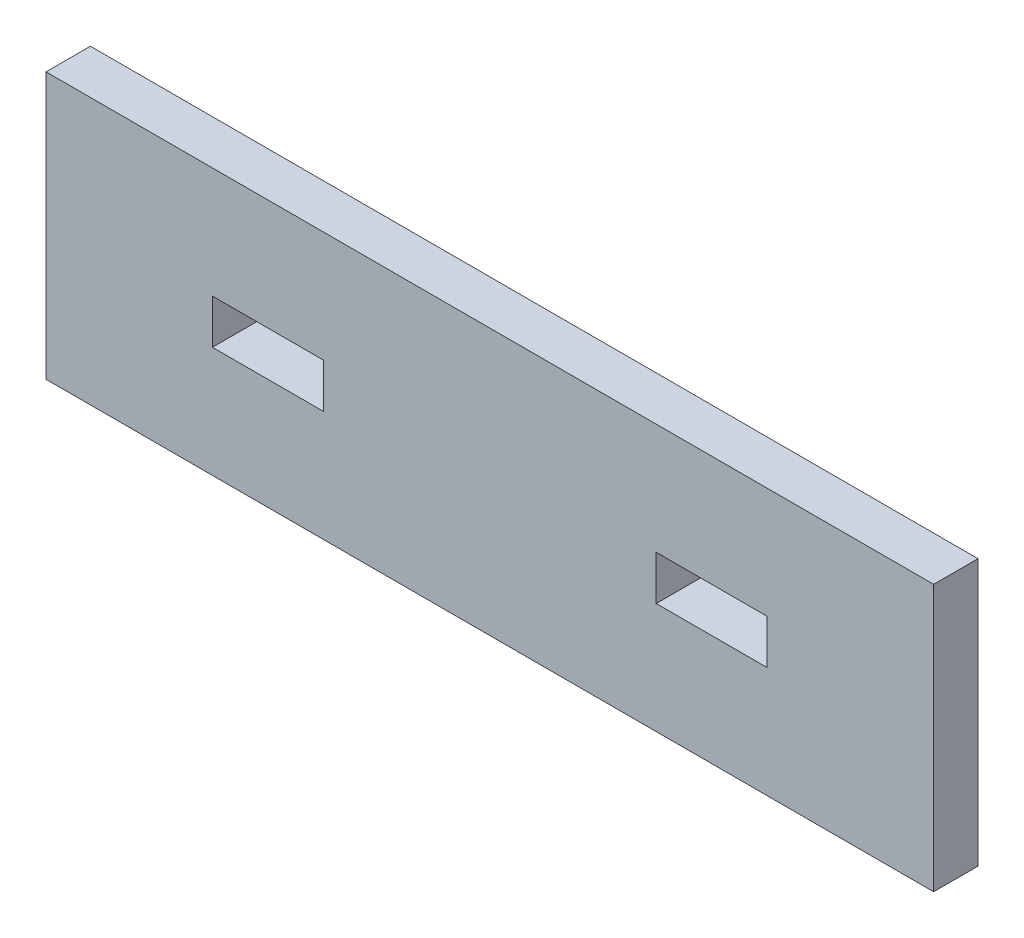
ISO-10303-21;
HEADER;
FILE_DESCRIPTION(('STEP AP214'),'2;1');
FILE_NAME('part.step','',(''),(''),'','','');
FILE_SCHEMA(('AUTOMOTIVE_DESIGN { 1 0 10303 214 1 1 1 1 }'));
ENDSEC;
DATA;
#1=APPLICATION_CONTEXT('core data for automotive mechanical design processes');
#2=APPLICATION_PROTOCOL_DEFINITION('international standard','automotive_design',2000,#1);
#3=PRODUCT_CONTEXT('',#1,'mechanical');
#4=PRODUCT('Part','Part','',(#3));
#5=PRODUCT_RELATED_PRODUCT_CATEGORY('part','',(#4));
#6=PRODUCT_DEFINITION_FORMATION('','',#4);
#7=PRODUCT_DEFINITION_CONTEXT('part definition',#1,'design');
#8=PRODUCT_DEFINITION('design','',#6,#7);
#9=PRODUCT_DEFINITION_SHAPE('','',#8);
#10=(LENGTH_UNIT() NAMED_UNIT(*) SI_UNIT(.MILLI.,.METRE.));
#11=(NAMED_UNIT(*) PLANE_ANGLE_UNIT() SI_UNIT($,.RADIAN.));
#12=(NAMED_UNIT(*) SI_UNIT($,.STERADIAN.) SOLID_ANGLE_UNIT());
#13=UNCERTAINTY_MEASURE_WITH_UNIT(LENGTH_MEASURE(1.E-05),#10,'distance_accuracy_value','');
#14=(GEOMETRIC_REPRESENTATION_CONTEXT(3) GLOBAL_UNCERTAINTY_ASSIGNED_CONTEXT((#13)) GLOBAL_UNIT_ASSIGNED_CONTEXT((#10,
#11,#12)) REPRESENTATION_CONTEXT('',''));
#15=CARTESIAN_POINT('',(0.,0.,0.));
#16=DIRECTION('',(0.,0.,1.));
#17=DIRECTION('',(1.,0.,0.));
#18=AXIS2_PLACEMENT_3D('',#15,#16,#17);
#19=CARTESIAN_POINT('',(0.,24.,4.));
#20=DIRECTION('',(0.,0.,-1.));
#21=DIRECTION('',(-1.,0.,0.));
#22=AXIS2_PLACEMENT_3D('',#19,#20,#21);
#23=PLANE('',#22);
#24=DIRECTION('',(0.,1.,0.));
#25=VECTOR('',#24,1.);
#26=CARTESIAN_POINT('',(25.,14.,4.));
#27=LINE('',#26,#25);
#28=CARTESIAN_POINT('',(25.,10.,4.));
#29=VERTEX_POINT('',#28);
#30=CARTESIAN_POINT('',(25.,14.,4.));
#31=VERTEX_POINT('',#30);
#32=EDGE_CURVE('E158',#29,#31,#27,.T.);
#33=ORIENTED_EDGE('',*,*,#32,.F.);
#34=DIRECTION('',(1.,0.,0.));
#35=VECTOR('',#34,1.);
#36=CARTESIAN_POINT('',(15.,10.,4.));
#37=LINE('',#36,#35);
#38=CARTESIAN_POINT('',(15.,10.,4.));
#39=VERTEX_POINT('',#38);
#40=EDGE_CURVE('E166',#39,#29,#37,.T.);
#41=ORIENTED_EDGE('',*,*,#40,.F.);
#42=DIRECTION('',(0.,-1.,0.));
#43=VECTOR('',#42,1.);
#44=CARTESIAN_POINT('',(15.,14.,4.));
#45=LINE('',#44,#43);
#46=CARTESIAN_POINT('',(15.,14.,4.));
#47=VERTEX_POINT('',#46);
#48=EDGE_CURVE('E163',#47,#39,#45,.T.);
#49=ORIENTED_EDGE('',*,*,#48,.F.);
#50=DIRECTION('',(-1.,0.,0.));
#51=VECTOR('',#50,1.);
#52=CARTESIAN_POINT('',(15.,14.,4.));
#53=LINE('',#52,#51);
#54=EDGE_CURVE('E160',#31,#47,#53,.T.);
#55=ORIENTED_EDGE('',*,*,#54,.F.);
#56=EDGE_LOOP('',(#33,#41,#49,#55));
#57=FACE_BOUND('',#56,.T.);
#58=DIRECTION('',(0.,-1.,0.));
#59=VECTOR('',#58,1.);
#60=CARTESIAN_POINT('',(0.,0.,4.));
#61=LINE('',#60,#59);
#62=CARTESIAN_POINT('',(0.,24.,4.));
#63=VERTEX_POINT('',#62);
#64=CARTESIAN_POINT('',(0.,0.,4.));
#65=VERTEX_POINT('',#64);
#66=EDGE_CURVE('E189',#63,#65,#61,.T.);
#67=ORIENTED_EDGE('',*,*,#66,.T.);
#68=DIRECTION('',(1.,0.,0.));
#69=VECTOR('',#68,1.);
#70=CARTESIAN_POINT('',(0.,0.,4.));
#71=LINE('',#70,#69);
#72=CARTESIAN_POINT('',(80.,0.,4.));
#73=VERTEX_POINT('',#72);
#74=EDGE_CURVE('E192',#65,#73,#71,.T.);
#75=ORIENTED_EDGE('',*,*,#74,.T.);
#76=DIRECTION('',(0.,1.,0.));
#77=VECTOR('',#76,1.);
#78=CARTESIAN_POINT('',(80.,0.,4.));
#79=LINE('',#78,#77);
#80=CARTESIAN_POINT('',(80.,24.,4.));
#81=VERTEX_POINT('',#80);
#82=EDGE_CURVE('E195',#73,#81,#79,.T.);
#83=ORIENTED_EDGE('',*,*,#82,.T.);
#84=DIRECTION('',(-1.,0.,0.));
#85=VECTOR('',#84,1.);
#86=CARTESIAN_POINT('',(0.,24.,4.));
#87=LINE('',#86,#85);
#88=EDGE_CURVE('E197',#81,#63,#87,.T.);
#89=ORIENTED_EDGE('',*,*,#88,.T.);
#90=EDGE_LOOP('',(#67,#75,#83,#89));
#91=FACE_BOUND('',#90,.T.);
#92=DIRECTION('',(0.,1.,0.));
#93=VECTOR('',#92,1.);
#94=CARTESIAN_POINT('',(65.,14.,4.));
#95=LINE('',#94,#93);
#96=CARTESIAN_POINT('',(65.,10.,4.));
#97=VERTEX_POINT('',#96);
#98=CARTESIAN_POINT('',(65.,14.,4.));
#99=VERTEX_POINT('',#98);
#100=EDGE_CURVE('E122',#97,#99,#95,.T.);
#101=ORIENTED_EDGE('',*,*,#100,.F.);
#102=DIRECTION('',(1.,0.,0.));
#103=VECTOR('',#102,1.);
#104=CARTESIAN_POINT('',(65.,10.,4.));
#105=LINE('',#104,#103);
#106=CARTESIAN_POINT('',(55.,10.,4.));
#107=VERTEX_POINT('',#106);
#108=EDGE_CURVE('E144',#107,#97,#105,.T.);
#109=ORIENTED_EDGE('',*,*,#108,.F.);
#110=DIRECTION('',(0.,-1.,0.));
#111=VECTOR('',#110,1.);
#112=CARTESIAN_POINT('',(55.,14.,4.));
#113=LINE('',#112,#111);
#114=CARTESIAN_POINT('',(55.,14.,4.));
#115=VERTEX_POINT('',#114);
#116=EDGE_CURVE('E142',#115,#107,#113,.T.);
#117=ORIENTED_EDGE('',*,*,#116,.F.);
#118=DIRECTION('',(-1.,0.,0.));
#119=VECTOR('',#118,1.);
#120=CARTESIAN_POINT('',(65.,14.,4.));
#121=LINE('',#120,#119);
#122=EDGE_CURVE('E130',#99,#115,#121,.T.);
#123=ORIENTED_EDGE('',*,*,#122,.F.);
#124=EDGE_LOOP('',(#101,#109,#117,#123));
#125=FACE_BOUND('',#124,.T.);
#126=ADVANCED_FACE('F33',(#57,#91,#125),#23,.F.);
#127=CARTESIAN_POINT('',(0.,24.,0.));
#128=DIRECTION('',(0.,0.,-1.));
#129=DIRECTION('',(-1.,0.,0.));
#130=AXIS2_PLACEMENT_3D('',#127,#128,#129);
#131=PLANE('',#130);
#132=DIRECTION('',(1.,0.,0.));
#133=VECTOR('',#132,1.);
#134=CARTESIAN_POINT('',(15.,10.,0.));
#135=LINE('',#134,#133);
#136=CARTESIAN_POINT('',(15.,10.,0.));
#137=VERTEX_POINT('',#136);
#138=CARTESIAN_POINT('',(25.,10.,0.));
#139=VERTEX_POINT('',#138);
#140=EDGE_CURVE('E161',#137,#139,#135,.T.);
#141=ORIENTED_EDGE('',*,*,#140,.T.);
#142=DIRECTION('',(0.,1.,0.));
#143=VECTOR('',#142,1.);
#144=CARTESIAN_POINT('',(25.,14.,0.));
#145=LINE('',#144,#143);
#146=CARTESIAN_POINT('',(25.,14.,0.));
#147=VERTEX_POINT('',#146);
#148=EDGE_CURVE('E138',#139,#147,#145,.T.);
#149=ORIENTED_EDGE('',*,*,#148,.T.);
#150=DIRECTION('',(-1.,0.,0.));
#151=VECTOR('',#150,1.);
#152=CARTESIAN_POINT('',(15.,14.,0.));
#153=LINE('',#152,#151);
#154=CARTESIAN_POINT('',(15.,14.,0.));
#155=VERTEX_POINT('',#154);
#156=EDGE_CURVE('E171',#147,#155,#153,.T.);
#157=ORIENTED_EDGE('',*,*,#156,.T.);
#158=DIRECTION('',(0.,-1.,0.));
#159=VECTOR('',#158,1.);
#160=CARTESIAN_POINT('',(15.,14.,0.));
#161=LINE('',#160,#159);
#162=EDGE_CURVE('E174',#155,#137,#161,.T.);
#163=ORIENTED_EDGE('',*,*,#162,.T.);
#164=EDGE_LOOP('',(#141,#149,#157,#163));
#165=FACE_BOUND('',#164,.T.);
#166=DIRECTION('',(0.,-1.,0.));
#167=VECTOR('',#166,1.);
#168=CARTESIAN_POINT('',(0.,0.,0.));
#169=LINE('',#168,#167);
#170=CARTESIAN_POINT('',(0.,24.,0.));
#171=VERTEX_POINT('',#170);
#172=CARTESIAN_POINT('',(0.,0.,0.));
#173=VERTEX_POINT('',#172);
#174=EDGE_CURVE('E188',#171,#173,#169,.T.);
#175=ORIENTED_EDGE('',*,*,#174,.F.);
#176=DIRECTION('',(-1.,0.,0.));
#177=VECTOR('',#176,1.);
#178=CARTESIAN_POINT('',(0.,24.,0.));
#179=LINE('',#178,#177);
#180=CARTESIAN_POINT('',(80.,24.,0.));
#181=VERTEX_POINT('',#180);
#182=EDGE_CURVE('E193',#181,#171,#179,.T.);
#183=ORIENTED_EDGE('',*,*,#182,.F.);
#184=DIRECTION('',(0.,1.,0.));
#185=VECTOR('',#184,1.);
#186=CARTESIAN_POINT('',(80.,0.,0.));
#187=LINE('',#186,#185);
#188=CARTESIAN_POINT('',(80.,0.,0.));
#189=VERTEX_POINT('',#188);
#190=EDGE_CURVE('E204',#189,#181,#187,.T.);
#191=ORIENTED_EDGE('',*,*,#190,.F.);
#192=DIRECTION('',(1.,0.,0.));
#193=VECTOR('',#192,1.);
#194=CARTESIAN_POINT('',(0.,0.,0.));
#195=LINE('',#194,#193);
#196=EDGE_CURVE('E202',#173,#189,#195,.T.);
#197=ORIENTED_EDGE('',*,*,#196,.F.);
#198=EDGE_LOOP('',(#175,#183,#191,#197));
#199=FACE_BOUND('',#198,.T.);
#200=DIRECTION('',(1.,0.,0.));
#201=VECTOR('',#200,1.);
#202=CARTESIAN_POINT('',(65.,10.,0.));
#203=LINE('',#202,#201);
#204=CARTESIAN_POINT('',(55.,10.,0.));
#205=VERTEX_POINT('',#204);
#206=CARTESIAN_POINT('',(65.,10.,0.));
#207=VERTEX_POINT('',#206);
#208=EDGE_CURVE('E131',#205,#207,#203,.T.);
#209=ORIENTED_EDGE('',*,*,#208,.T.);
#210=DIRECTION('',(0.,1.,0.));
#211=VECTOR('',#210,1.);
#212=CARTESIAN_POINT('',(65.,14.,0.));
#213=LINE('',#212,#211);
#214=CARTESIAN_POINT('',(65.,14.,0.));
#215=VERTEX_POINT('',#214);
#216=EDGE_CURVE('E56',#207,#215,#213,.T.);
#217=ORIENTED_EDGE('',*,*,#216,.T.);
#218=DIRECTION('',(-1.,0.,0.));
#219=VECTOR('',#218,1.);
#220=CARTESIAN_POINT('',(65.,14.,0.));
#221=LINE('',#220,#219);
#222=CARTESIAN_POINT('',(55.,14.,0.));
#223=VERTEX_POINT('',#222);
#224=EDGE_CURVE('E137',#215,#223,#221,.T.);
#225=ORIENTED_EDGE('',*,*,#224,.T.);
#226=DIRECTION('',(0.,-1.,0.));
#227=VECTOR('',#226,1.);
#228=CARTESIAN_POINT('',(55.,14.,0.));
#229=LINE('',#228,#227);
#230=EDGE_CURVE('E150',#223,#205,#229,.T.);
#231=ORIENTED_EDGE('',*,*,#230,.T.);
#232=EDGE_LOOP('',(#209,#217,#225,#231));
#233=FACE_BOUND('',#232,.T.);
#234=ADVANCED_FACE('F222',(#165,#199,#233),#131,.T.);
#235=CARTESIAN_POINT('',(0.,0.,4.));
#236=DIRECTION('',(1.,0.,0.));
#237=DIRECTION('',(0.,0.,-1.));
#238=AXIS2_PLACEMENT_3D('',#235,#236,#237);
#239=PLANE('',#238);
#240=ORIENTED_EDGE('',*,*,#174,.T.);
#241=DIRECTION('',(0.,0.,-1.));
#242=VECTOR('',#241,1.);
#243=CARTESIAN_POINT('',(0.,0.,4.));
#244=LINE('',#243,#242);
#245=EDGE_CURVE('E11',#65,#173,#244,.T.);
#246=ORIENTED_EDGE('',*,*,#245,.F.);
#247=ORIENTED_EDGE('',*,*,#66,.F.);
#248=DIRECTION('',(0.,0.,-1.));
#249=VECTOR('',#248,1.);
#250=CARTESIAN_POINT('',(0.,24.,4.));
#251=LINE('',#250,#249);
#252=EDGE_CURVE('E199',#63,#171,#251,.T.);
#253=ORIENTED_EDGE('',*,*,#252,.T.);
#254=EDGE_LOOP('',(#240,#246,#247,#253));
#255=FACE_BOUND('',#254,.T.);
#256=ADVANCED_FACE('F35',(#255),#239,.F.);
#257=CARTESIAN_POINT('',(0.,0.,4.));
#258=DIRECTION('',(0.,1.,0.));
#259=DIRECTION('',(0.,0.,1.));
#260=AXIS2_PLACEMENT_3D('',#257,#258,#259);
#261=PLANE('',#260);
#262=ORIENTED_EDGE('',*,*,#196,.T.);
#263=DIRECTION('',(0.,0.,-1.));
#264=VECTOR('',#263,1.);
#265=CARTESIAN_POINT('',(80.,0.,4.));
#266=LINE('',#265,#264);
#267=EDGE_CURVE('E41',#73,#189,#266,.T.);
#268=ORIENTED_EDGE('',*,*,#267,.F.);
#269=ORIENTED_EDGE('',*,*,#74,.F.);
#270=ORIENTED_EDGE('',*,*,#245,.T.);
#271=EDGE_LOOP('',(#262,#268,#269,#270));
#272=FACE_BOUND('',#271,.T.);
#273=ADVANCED_FACE('F232',(#272),#261,.F.);
#274=CARTESIAN_POINT('',(80.,0.,4.));
#275=DIRECTION('',(-1.,0.,0.));
#276=DIRECTION('',(0.,0.,1.));
#277=AXIS2_PLACEMENT_3D('',#274,#275,#276);
#278=PLANE('',#277);
#279=ORIENTED_EDGE('',*,*,#190,.T.);
#280=DIRECTION('',(0.,0.,-1.));
#281=VECTOR('',#280,1.);
#282=CARTESIAN_POINT('',(80.,24.,4.));
#283=LINE('',#282,#281);
#284=EDGE_CURVE('E209',#81,#181,#283,.T.);
#285=ORIENTED_EDGE('',*,*,#284,.F.);
#286=ORIENTED_EDGE('',*,*,#82,.F.);
#287=ORIENTED_EDGE('',*,*,#267,.T.);
#288=EDGE_LOOP('',(#279,#285,#286,#287));
#289=FACE_BOUND('',#288,.T.);
#290=ADVANCED_FACE('F216',(#289),#278,.F.);
#291=CARTESIAN_POINT('',(0.,24.,4.));
#292=DIRECTION('',(0.,-1.,0.));
#293=DIRECTION('',(0.,0.,-1.));
#294=AXIS2_PLACEMENT_3D('',#291,#292,#293);
#295=PLANE('',#294);
#296=ORIENTED_EDGE('',*,*,#182,.T.);
#297=ORIENTED_EDGE('',*,*,#252,.F.);
#298=ORIENTED_EDGE('',*,*,#88,.F.);
#299=ORIENTED_EDGE('',*,*,#284,.T.);
#300=EDGE_LOOP('',(#296,#297,#298,#299));
#301=FACE_BOUND('',#300,.T.);
#302=ADVANCED_FACE('F226',(#301),#295,.F.);
#303=CARTESIAN_POINT('',(25.,14.,4.));
#304=DIRECTION('',(-1.,0.,0.));
#305=DIRECTION('',(0.,0.,1.));
#306=AXIS2_PLACEMENT_3D('',#303,#304,#305);
#307=PLANE('',#306);
#308=ORIENTED_EDGE('',*,*,#148,.F.);
#309=DIRECTION('',(0.,0.,-1.));
#310=VECTOR('',#309,1.);
#311=CARTESIAN_POINT('',(25.,10.,4.));
#312=LINE('',#311,#310);
#313=EDGE_CURVE('E168',#29,#139,#312,.T.);
#314=ORIENTED_EDGE('',*,*,#313,.F.);
#315=ORIENTED_EDGE('',*,*,#32,.T.);
#316=DIRECTION('',(0.,0.,-1.));
#317=VECTOR('',#316,1.);
#318=CARTESIAN_POINT('',(25.,14.,4.));
#319=LINE('',#318,#317);
#320=EDGE_CURVE('E185',#31,#147,#319,.T.);
#321=ORIENTED_EDGE('',*,*,#320,.T.);
#322=EDGE_LOOP('',(#308,#314,#315,#321));
#323=FACE_BOUND('',#322,.T.);
#324=ADVANCED_FACE('F249',(#323),#307,.T.);
#325=CARTESIAN_POINT('',(15.,14.,4.));
#326=DIRECTION('',(0.,-1.,0.));
#327=DIRECTION('',(0.,0.,-1.));
#328=AXIS2_PLACEMENT_3D('',#325,#326,#327);
#329=PLANE('',#328);
#330=ORIENTED_EDGE('',*,*,#156,.F.);
#331=ORIENTED_EDGE('',*,*,#320,.F.);
#332=ORIENTED_EDGE('',*,*,#54,.T.);
#333=DIRECTION('',(0.,0.,-1.));
#334=VECTOR('',#333,1.);
#335=CARTESIAN_POINT('',(15.,14.,4.));
#336=LINE('',#335,#334);
#337=EDGE_CURVE('E183',#47,#155,#336,.T.);
#338=ORIENTED_EDGE('',*,*,#337,.T.);
#339=EDGE_LOOP('',(#330,#331,#332,#338));
#340=FACE_BOUND('',#339,.T.);
#341=ADVANCED_FACE('F256',(#340),#329,.T.);
#342=CARTESIAN_POINT('',(15.,14.,4.));
#343=DIRECTION('',(1.,0.,0.));
#344=DIRECTION('',(0.,0.,-1.));
#345=AXIS2_PLACEMENT_3D('',#342,#343,#344);
#346=PLANE('',#345);
#347=ORIENTED_EDGE('',*,*,#162,.F.);
#348=ORIENTED_EDGE('',*,*,#337,.F.);
#349=ORIENTED_EDGE('',*,*,#48,.T.);
#350=DIRECTION('',(0.,0.,-1.));
#351=VECTOR('',#350,1.);
#352=CARTESIAN_POINT('',(15.,10.,4.));
#353=LINE('',#352,#351);
#354=EDGE_CURVE('E181',#39,#137,#353,.T.);
#355=ORIENTED_EDGE('',*,*,#354,.T.);
#356=EDGE_LOOP('',(#347,#348,#349,#355));
#357=FACE_BOUND('',#356,.T.);
#358=ADVANCED_FACE('F261',(#357),#346,.T.);
#359=CARTESIAN_POINT('',(15.,10.,4.));
#360=DIRECTION('',(0.,1.,0.));
#361=DIRECTION('',(0.,0.,1.));
#362=AXIS2_PLACEMENT_3D('',#359,#360,#361);
#363=PLANE('',#362);
#364=ORIENTED_EDGE('',*,*,#140,.F.);
#365=ORIENTED_EDGE('',*,*,#354,.F.);
#366=ORIENTED_EDGE('',*,*,#40,.T.);
#367=ORIENTED_EDGE('',*,*,#313,.T.);
#368=EDGE_LOOP('',(#364,#365,#366,#367));
#369=FACE_BOUND('',#368,.T.);
#370=ADVANCED_FACE('F267',(#369),#363,.T.);
#371=CARTESIAN_POINT('',(65.,14.,4.));
#372=DIRECTION('',(-1.,0.,0.));
#373=DIRECTION('',(0.,0.,1.));
#374=AXIS2_PLACEMENT_3D('',#371,#372,#373);
#375=PLANE('',#374);
#376=ORIENTED_EDGE('',*,*,#216,.F.);
#377=DIRECTION('',(0.,0.,-1.));
#378=VECTOR('',#377,1.);
#379=CARTESIAN_POINT('',(65.,10.,4.));
#380=LINE('',#379,#378);
#381=EDGE_CURVE('E126',#97,#207,#380,.T.);
#382=ORIENTED_EDGE('',*,*,#381,.F.);
#383=ORIENTED_EDGE('',*,*,#100,.T.);
#384=DIRECTION('',(0.,0.,-1.));
#385=VECTOR('',#384,1.);
#386=CARTESIAN_POINT('',(65.,14.,4.));
#387=LINE('',#386,#385);
#388=EDGE_CURVE('E125',#99,#215,#387,.T.);
#389=ORIENTED_EDGE('',*,*,#388,.T.);
#390=EDGE_LOOP('',(#376,#382,#383,#389));
#391=FACE_BOUND('',#390,.T.);
#392=ADVANCED_FACE('F124',(#391),#375,.T.);
#393=CARTESIAN_POINT('',(65.,14.,4.));
#394=DIRECTION('',(0.,-1.,0.));
#395=DIRECTION('',(0.,0.,-1.));
#396=AXIS2_PLACEMENT_3D('',#393,#394,#395);
#397=PLANE('',#396);
#398=ORIENTED_EDGE('',*,*,#224,.F.);
#399=ORIENTED_EDGE('',*,*,#388,.F.);
#400=ORIENTED_EDGE('',*,*,#122,.T.);
#401=DIRECTION('',(0.,0.,-1.));
#402=VECTOR('',#401,1.);
#403=CARTESIAN_POINT('',(55.,14.,4.));
#404=LINE('',#403,#402);
#405=EDGE_CURVE('E139',#115,#223,#404,.T.);
#406=ORIENTED_EDGE('',*,*,#405,.T.);
#407=EDGE_LOOP('',(#398,#399,#400,#406));
#408=FACE_BOUND('',#407,.T.);
#409=ADVANCED_FACE('F134',(#408),#397,.T.);
#410=CARTESIAN_POINT('',(55.,14.,4.));
#411=DIRECTION('',(1.,0.,0.));
#412=DIRECTION('',(0.,0.,-1.));
#413=AXIS2_PLACEMENT_3D('',#410,#411,#412);
#414=PLANE('',#413);
#415=ORIENTED_EDGE('',*,*,#230,.F.);
#416=ORIENTED_EDGE('',*,*,#405,.F.);
#417=ORIENTED_EDGE('',*,*,#116,.T.);
#418=DIRECTION('',(0.,0.,-1.));
#419=VECTOR('',#418,1.);
#420=CARTESIAN_POINT('',(55.,10.,4.));
#421=LINE('',#420,#419);
#422=EDGE_CURVE('E48',#107,#205,#421,.T.);
#423=ORIENTED_EDGE('',*,*,#422,.T.);
#424=EDGE_LOOP('',(#415,#416,#417,#423));
#425=FACE_BOUND('',#424,.T.);
#426=ADVANCED_FACE('F285',(#425),#414,.T.);
#427=CARTESIAN_POINT('',(65.,10.,4.));
#428=DIRECTION('',(0.,1.,0.));
#429=DIRECTION('',(0.,0.,1.));
#430=AXIS2_PLACEMENT_3D('',#427,#428,#429);
#431=PLANE('',#430);
#432=ORIENTED_EDGE('',*,*,#208,.F.);
#433=ORIENTED_EDGE('',*,*,#422,.F.);
#434=ORIENTED_EDGE('',*,*,#108,.T.);
#435=ORIENTED_EDGE('',*,*,#381,.T.);
#436=EDGE_LOOP('',(#432,#433,#434,#435));
#437=FACE_BOUND('',#436,.T.);
#438=ADVANCED_FACE('F288',(#437),#431,.T.);
#439=CLOSED_SHELL('',(#126,#234,#256,#273,#290,#302,#324,#341,#358,#370,#392,#409,#426,#438));
#440=MANIFOLD_SOLID_BREP('B2',#439);
#441=ADVANCED_BREP_SHAPE_REPRESENTATION('',(#18,#440),#14);
#442=SHAPE_DEFINITION_REPRESENTATION(#9,#441);
ENDSEC;
END-ISO-10303-21;
